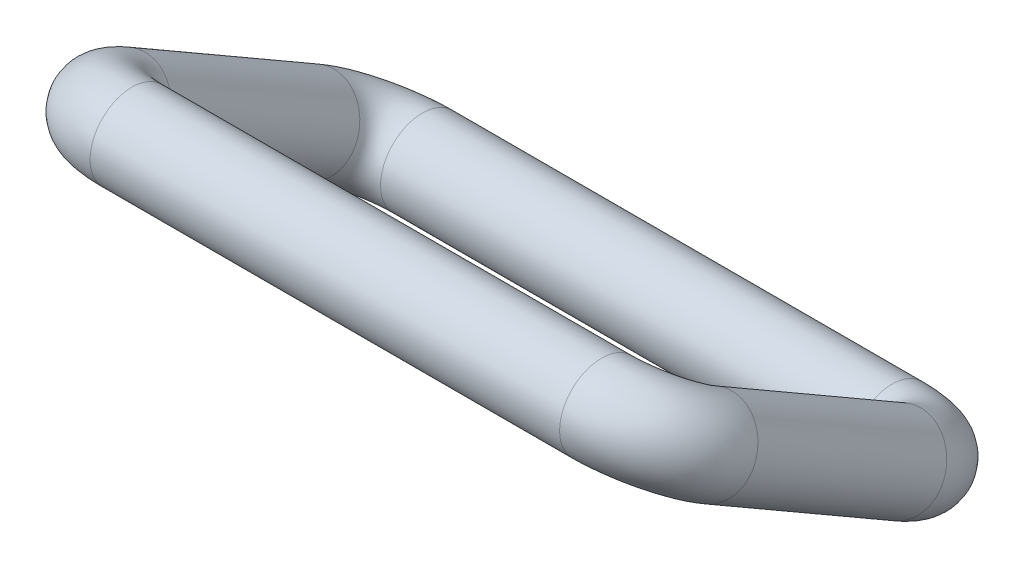
ISO-10303-21;
HEADER;
FILE_DESCRIPTION(('STEP AP214'),'2;1');
FILE_NAME('part.step','',(''),(''),'','','');
FILE_SCHEMA(('AUTOMOTIVE_DESIGN { 1 0 10303 214 1 1 1 1 }'));
ENDSEC;
DATA;
#1=APPLICATION_CONTEXT('core data for automotive mechanical design processes');
#2=APPLICATION_PROTOCOL_DEFINITION('international standard','automotive_design',2000,#1);
#3=PRODUCT_CONTEXT('',#1,'mechanical');
#4=PRODUCT('Part','Part','',(#3));
#5=PRODUCT_RELATED_PRODUCT_CATEGORY('part','',(#4));
#6=PRODUCT_DEFINITION_FORMATION('','',#4);
#7=PRODUCT_DEFINITION_CONTEXT('part definition',#1,'design');
#8=PRODUCT_DEFINITION('design','',#6,#7);
#9=PRODUCT_DEFINITION_SHAPE('','',#8);
#10=(LENGTH_UNIT() NAMED_UNIT(*) SI_UNIT(.MILLI.,.METRE.));
#11=(NAMED_UNIT(*) PLANE_ANGLE_UNIT() SI_UNIT($,.RADIAN.));
#12=(NAMED_UNIT(*) SI_UNIT($,.STERADIAN.) SOLID_ANGLE_UNIT());
#13=UNCERTAINTY_MEASURE_WITH_UNIT(LENGTH_MEASURE(1.E-05),#10,'distance_accuracy_value','');
#14=(GEOMETRIC_REPRESENTATION_CONTEXT(3) GLOBAL_UNCERTAINTY_ASSIGNED_CONTEXT((#13)) GLOBAL_UNIT_ASSIGNED_CONTEXT((#10,
#11,#12)) REPRESENTATION_CONTEXT('',''));
#15=CARTESIAN_POINT('',(0.,0.,0.));
#16=DIRECTION('',(0.,0.,1.));
#17=DIRECTION('',(1.,0.,0.));
#18=AXIS2_PLACEMENT_3D('',#15,#16,#17);
#19=CARTESIAN_POINT('',(5.24,-12.4487116222689,-0.381613321613643));
#20=DIRECTION('',(0.,0.500000000000007,0.866025403784435));
#21=DIRECTION('',(-1.,0.,0.));
#22=AXIS2_PLACEMENT_3D('',#19,#20,#21);
#23=CYLINDRICAL_SURFACE('',#22,0.6);
#24=CARTESIAN_POINT('',(5.24,-10.8887116222688,2.32038593819378));
#25=DIRECTION('',(0.,-0.500000000000007,-0.866025403784435));
#26=DIRECTION('',(1.,0.,0.));
#27=AXIS2_PLACEMENT_3D('',#24,#25,#26);
#28=CIRCLE('',#27,0.6);
#29=CARTESIAN_POINT('',(5.84,-10.8887116222688,2.32038593819378));
#30=VERTEX_POINT('',#29);
#31=EDGE_CURVE('E121',#30,#30,#28,.T.);
#32=ORIENTED_EDGE('',*,*,#31,.T.);
#33=DIRECTION('',(0.,-0.500000000000007,-0.866025403784435));
#34=VECTOR('',#33,1.);
#35=CARTESIAN_POINT('',(5.84,-12.4487116222689,-0.381613321613643));
#36=LINE('',#35,#34);
#37=CARTESIAN_POINT('',(5.84,-12.4487116222689,-0.381613321613647));
#38=VERTEX_POINT('',#37);
#39=EDGE_CURVE('E11',#30,#38,#36,.T.);
#40=ORIENTED_EDGE('',*,*,#39,.T.);
#41=CARTESIAN_POINT('',(5.24,-12.4487116222689,-0.381613321613643));
#42=DIRECTION('',(0.,-0.500000000000007,-0.866025403784435));
#43=DIRECTION('',(1.,0.,0.));
#44=AXIS2_PLACEMENT_3D('',#41,#42,#43);
#45=CIRCLE('',#44,0.6);
#46=EDGE_CURVE('E110',#38,#38,#45,.T.);
#47=ORIENTED_EDGE('',*,*,#46,.F.);
#48=ORIENTED_EDGE('',*,*,#39,.F.);
#49=EDGE_LOOP('',(#32,#40,#47,#48));
#50=FACE_BOUND('',#49,.T.);
#51=ADVANCED_FACE('F16',(#50),#23,.T.);
#52=CARTESIAN_POINT('',(6.08,-10.4687116222688,3.04784727737271));
#53=DIRECTION('',(1.,0.,0.));
#54=DIRECTION('',(0.,0.500000000000007,0.866025403784435));
#55=AXIS2_PLACEMENT_3D('',#52,#53,#54);
#56=CYLINDRICAL_SURFACE('',#55,0.6);
#57=CARTESIAN_POINT('',(12.8,-10.4687116222688,3.04784727737271));
#58=DIRECTION('',(-1.,0.,0.));
#59=DIRECTION('',(0.,-0.500000000000007,-0.866025403784434));
#60=AXIS2_PLACEMENT_3D('',#57,#58,#59);
#61=CIRCLE('',#60,0.6);
#62=CARTESIAN_POINT('',(12.8,-10.7687116222688,2.52823203510205));
#63=VERTEX_POINT('',#62);
#64=EDGE_CURVE('E89',#63,#63,#61,.T.);
#65=ORIENTED_EDGE('',*,*,#64,.T.);
#66=DIRECTION('',(-1.,0.,0.));
#67=VECTOR('',#66,1.);
#68=CARTESIAN_POINT('',(6.08,-10.7687116222688,2.52823203510205));
#69=LINE('',#68,#67);
#70=CARTESIAN_POINT('',(6.08,-10.7687116222688,2.52823203510205));
#71=VERTEX_POINT('',#70);
#72=EDGE_CURVE('E26',#63,#71,#69,.T.);
#73=ORIENTED_EDGE('',*,*,#72,.T.);
#74=CARTESIAN_POINT('',(6.08,-10.4687116222688,3.04784727737271));
#75=DIRECTION('',(-1.,0.,0.));
#76=DIRECTION('',(0.,-0.500000000000007,-0.866025403784434));
#77=AXIS2_PLACEMENT_3D('',#74,#75,#76);
#78=CIRCLE('',#77,0.6);
#79=EDGE_CURVE('E20',#71,#71,#78,.T.);
#80=ORIENTED_EDGE('',*,*,#79,.F.);
#81=ORIENTED_EDGE('',*,*,#72,.F.);
#82=EDGE_LOOP('',(#65,#73,#80,#81));
#83=FACE_BOUND('',#82,.T.);
#84=ADVANCED_FACE('F18',(#83),#56,.T.);
#85=CARTESIAN_POINT('',(13.64,-10.8887116222688,2.32038593819378));
#86=DIRECTION('',(0.,-0.500000000000007,-0.866025403784435));
#87=DIRECTION('',(1.,0.,0.));
#88=AXIS2_PLACEMENT_3D('',#85,#86,#87);
#89=CYLINDRICAL_SURFACE('',#88,0.6);
#90=CARTESIAN_POINT('',(13.64,-12.4487116222689,-0.381613321613643));
#91=DIRECTION('',(0.,0.500000000000007,0.866025403784435));
#92=DIRECTION('',(-1.,0.,0.));
#93=AXIS2_PLACEMENT_3D('',#90,#91,#92);
#94=CIRCLE('',#93,0.6);
#95=CARTESIAN_POINT('',(13.04,-12.4487116222689,-0.381613321613643));
#96=VERTEX_POINT('',#95);
#97=EDGE_CURVE('E82',#96,#96,#94,.T.);
#98=ORIENTED_EDGE('',*,*,#97,.T.);
#99=DIRECTION('',(0.,0.500000000000007,0.866025403784435));
#100=VECTOR('',#99,1.);
#101=CARTESIAN_POINT('',(13.04,-10.8887116222688,2.32038593819378));
#102=LINE('',#101,#100);
#103=CARTESIAN_POINT('',(13.04,-10.8887116222688,2.32038593819379));
#104=VERTEX_POINT('',#103);
#105=EDGE_CURVE('E76',#96,#104,#102,.T.);
#106=ORIENTED_EDGE('',*,*,#105,.T.);
#107=CARTESIAN_POINT('',(13.64,-10.8887116222688,2.32038593819378));
#108=DIRECTION('',(0.,0.500000000000007,0.866025403784435));
#109=DIRECTION('',(-1.,0.,0.));
#110=AXIS2_PLACEMENT_3D('',#107,#108,#109);
#111=CIRCLE('',#110,0.6);
#112=EDGE_CURVE('E80',#104,#104,#111,.T.);
#113=ORIENTED_EDGE('',*,*,#112,.F.);
#114=ORIENTED_EDGE('',*,*,#105,.F.);
#115=EDGE_LOOP('',(#98,#106,#113,#114));
#116=FACE_BOUND('',#115,.T.);
#117=ADVANCED_FACE('F78',(#116),#89,.T.);
#118=CARTESIAN_POINT('',(12.8,-12.8687116222689,-1.10907466079257));
#119=DIRECTION('',(-1.,0.,0.));
#120=DIRECTION('',(0.,-0.500000000000007,-0.866025403784435));
#121=AXIS2_PLACEMENT_3D('',#118,#119,#120);
#122=CYLINDRICAL_SURFACE('',#121,0.6);
#123=CARTESIAN_POINT('',(6.08,-12.8687116222689,-1.10907466079257));
#124=DIRECTION('',(1.,0.,0.));
#125=DIRECTION('',(0.,0.500000000000007,0.866025403784435));
#126=AXIS2_PLACEMENT_3D('',#123,#124,#125);
#127=CIRCLE('',#126,0.6);
#128=CARTESIAN_POINT('',(6.08,-12.5687116222689,-0.589459418521909));
#129=VERTEX_POINT('',#128);
#130=EDGE_CURVE('E109',#129,#129,#127,.T.);
#131=ORIENTED_EDGE('',*,*,#130,.T.);
#132=DIRECTION('',(1.,0.,0.));
#133=VECTOR('',#132,1.);
#134=CARTESIAN_POINT('',(12.8,-12.5687116222689,-0.589459418521912));
#135=LINE('',#134,#133);
#136=CARTESIAN_POINT('',(12.8,-12.5687116222689,-0.589459418521909));
#137=VERTEX_POINT('',#136);
#138=EDGE_CURVE('E39',#129,#137,#135,.T.);
#139=ORIENTED_EDGE('',*,*,#138,.T.);
#140=CARTESIAN_POINT('',(12.8,-12.8687116222689,-1.10907466079257));
#141=DIRECTION('',(1.,0.,0.));
#142=DIRECTION('',(0.,0.500000000000007,0.866025403784435));
#143=AXIS2_PLACEMENT_3D('',#140,#141,#142);
#144=CIRCLE('',#143,0.6);
#145=EDGE_CURVE('E100',#137,#137,#144,.T.);
#146=ORIENTED_EDGE('',*,*,#145,.F.);
#147=ORIENTED_EDGE('',*,*,#138,.F.);
#148=EDGE_LOOP('',(#131,#139,#146,#147));
#149=FACE_BOUND('',#148,.T.);
#150=ADVANCED_FACE('F184',(#149),#122,.T.);
#151=CARTESIAN_POINT('',(6.08,-12.4487116222689,-0.381613321613649));
#152=DIRECTION('',(0.,0.866025403784435,-0.500000000000007));
#153=DIRECTION('',(0.,0.500000000000007,0.866025403784435));
#154=AXIS2_PLACEMENT_3D('',#151,#152,#153);
#155=TOROIDAL_SURFACE('',#154,0.84,0.6);
#156=ORIENTED_EDGE('',*,*,#46,.T.);
#157=CARTESIAN_POINT('',(6.08,-12.4487116222689,-0.381613321613648));
#158=DIRECTION('',(0.,-0.866025403784434,0.500000000000007));
#159=DIRECTION('',(0.,0.500000000000007,0.866025403784435));
#160=AXIS2_PLACEMENT_3D('',#157,#158,#159);
#161=CIRCLE('',#160,0.24);
#162=EDGE_CURVE('E105',#38,#129,#161,.T.);
#163=ORIENTED_EDGE('',*,*,#162,.T.);
#164=ORIENTED_EDGE('',*,*,#130,.F.);
#165=ORIENTED_EDGE('',*,*,#162,.F.);
#166=EDGE_LOOP('',(#156,#163,#164,#165));
#167=FACE_BOUND('',#166,.T.);
#168=ADVANCED_FACE('F188',(#167),#155,.T.);
#169=CARTESIAN_POINT('',(6.08,-10.8887116222688,2.32038593819379));
#170=DIRECTION('',(0.,0.866025403784435,-0.500000000000006));
#171=DIRECTION('',(0.,0.500000000000006,0.866025403784435));
#172=AXIS2_PLACEMENT_3D('',#169,#170,#171);
#173=TOROIDAL_SURFACE('',#172,0.84,0.6);
#174=ORIENTED_EDGE('',*,*,#79,.T.);
#175=CARTESIAN_POINT('',(6.08,-10.8887116222688,2.32038593819379));
#176=DIRECTION('',(0.,-0.866025403784435,0.500000000000007));
#177=DIRECTION('',(0.,0.500000000000007,0.866025403784435));
#178=AXIS2_PLACEMENT_3D('',#175,#176,#177);
#179=CIRCLE('',#178,0.24);
#180=EDGE_CURVE('E117',#71,#30,#179,.T.);
#181=ORIENTED_EDGE('',*,*,#180,.T.);
#182=ORIENTED_EDGE('',*,*,#31,.F.);
#183=ORIENTED_EDGE('',*,*,#180,.F.);
#184=EDGE_LOOP('',(#174,#181,#182,#183));
#185=FACE_BOUND('',#184,.T.);
#186=ADVANCED_FACE('F141',(#185),#173,.T.);
#187=CARTESIAN_POINT('',(12.8,-10.8887116222688,2.32038593819379));
#188=DIRECTION('',(0.,0.866025403784435,-0.500000000000006));
#189=DIRECTION('',(0.,0.500000000000006,0.866025403784435));
#190=AXIS2_PLACEMENT_3D('',#187,#188,#189);
#191=TOROIDAL_SURFACE('',#190,0.84,0.6);
#192=ORIENTED_EDGE('',*,*,#112,.T.);
#193=CARTESIAN_POINT('',(12.8,-10.8887116222688,2.32038593819379));
#194=DIRECTION('',(0.,-0.866025403784435,0.500000000000007));
#195=DIRECTION('',(0.,0.500000000000007,0.866025403784435));
#196=AXIS2_PLACEMENT_3D('',#193,#194,#195);
#197=CIRCLE('',#196,0.24);
#198=EDGE_CURVE('E87',#104,#63,#197,.T.);
#199=ORIENTED_EDGE('',*,*,#198,.T.);
#200=ORIENTED_EDGE('',*,*,#64,.F.);
#201=ORIENTED_EDGE('',*,*,#198,.F.);
#202=EDGE_LOOP('',(#192,#199,#200,#201));
#203=FACE_BOUND('',#202,.T.);
#204=ADVANCED_FACE('F88',(#203),#191,.T.);
#205=CARTESIAN_POINT('',(12.8,-12.4487116222689,-0.381613321613649));
#206=DIRECTION('',(0.,0.866025403784435,-0.500000000000006));
#207=DIRECTION('',(0.,0.500000000000006,0.866025403784435));
#208=AXIS2_PLACEMENT_3D('',#205,#206,#207);
#209=TOROIDAL_SURFACE('',#208,0.84,0.6);
#210=ORIENTED_EDGE('',*,*,#145,.T.);
#211=CARTESIAN_POINT('',(12.8,-12.4487116222689,-0.381613321613648));
#212=DIRECTION('',(0.,-0.866025403784434,0.500000000000007));
#213=DIRECTION('',(0.,0.500000000000007,0.866025403784435));
#214=AXIS2_PLACEMENT_3D('',#211,#212,#213);
#215=CIRCLE('',#214,0.24);
#216=EDGE_CURVE('E111',#137,#96,#215,.T.);
#217=ORIENTED_EDGE('',*,*,#216,.T.);
#218=ORIENTED_EDGE('',*,*,#97,.F.);
#219=ORIENTED_EDGE('',*,*,#216,.F.);
#220=EDGE_LOOP('',(#210,#217,#218,#219));
#221=FACE_BOUND('',#220,.T.);
#222=ADVANCED_FACE('F197',(#221),#209,.T.);
#223=CLOSED_SHELL('',(#51,#84,#117,#150,#168,#186,#204,#222));
#224=MANIFOLD_SOLID_BREP('B1',#223);
#225=ADVANCED_BREP_SHAPE_REPRESENTATION('',(#18,#224),#14);
#226=SHAPE_DEFINITION_REPRESENTATION(#9,#225);
ENDSEC;
END-ISO-10303-21;
